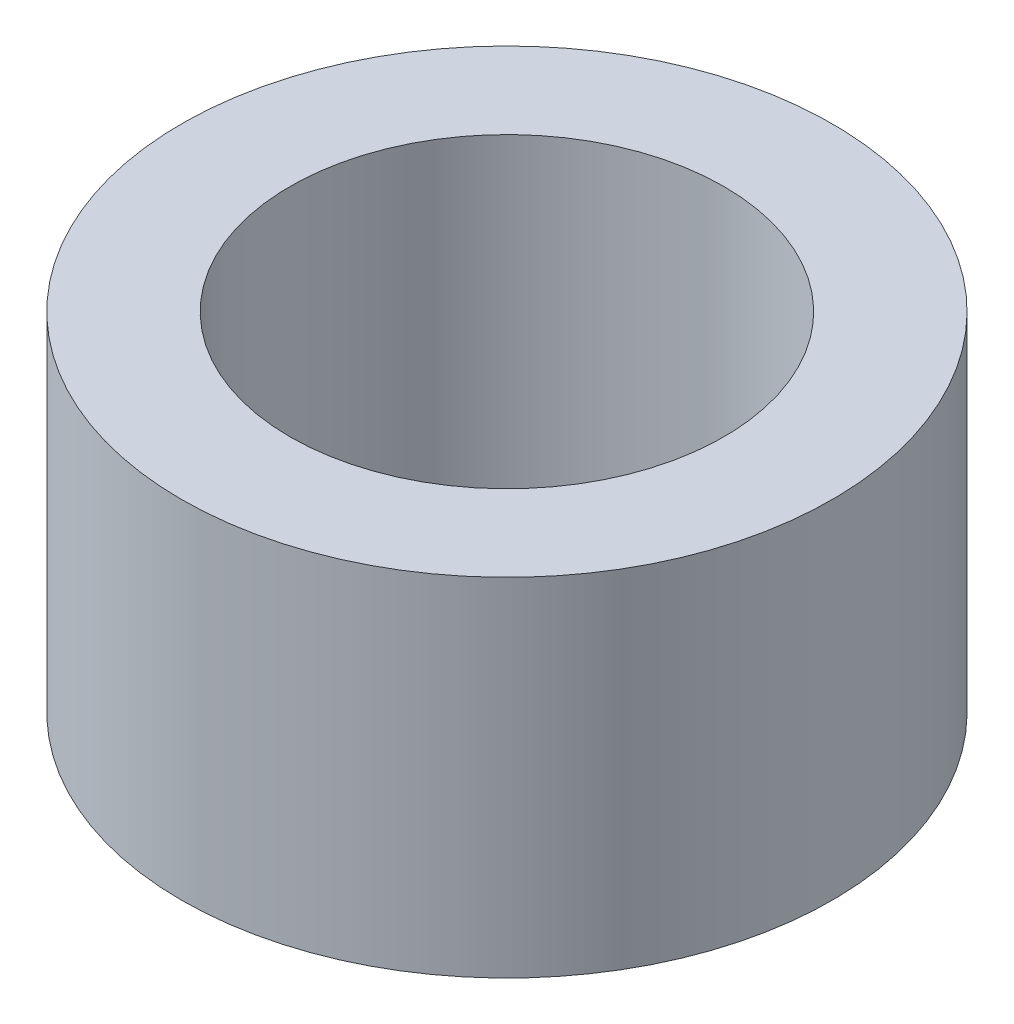
ISO-10303-21;
HEADER;
FILE_DESCRIPTION(('STEP AP214'),'2;1');
FILE_NAME('part.step','',(''),(''),'','','');
FILE_SCHEMA(('AUTOMOTIVE_DESIGN { 1 0 10303 214 1 1 1 1 }'));
ENDSEC;
DATA;
#1=APPLICATION_CONTEXT('core data for automotive mechanical design processes');
#2=APPLICATION_PROTOCOL_DEFINITION('international standard','automotive_design',2000,#1);
#3=PRODUCT_CONTEXT('',#1,'mechanical');
#4=PRODUCT('Part','Part','',(#3));
#5=PRODUCT_RELATED_PRODUCT_CATEGORY('part','',(#4));
#6=PRODUCT_DEFINITION_FORMATION('','',#4);
#7=PRODUCT_DEFINITION_CONTEXT('part definition',#1,'design');
#8=PRODUCT_DEFINITION('design','',#6,#7);
#9=PRODUCT_DEFINITION_SHAPE('','',#8);
#10=(LENGTH_UNIT() NAMED_UNIT(*) SI_UNIT(.MILLI.,.METRE.));
#11=(NAMED_UNIT(*) PLANE_ANGLE_UNIT() SI_UNIT($,.RADIAN.));
#12=(NAMED_UNIT(*) SI_UNIT($,.STERADIAN.) SOLID_ANGLE_UNIT());
#13=UNCERTAINTY_MEASURE_WITH_UNIT(LENGTH_MEASURE(1.E-05),#10,'distance_accuracy_value','');
#14=(GEOMETRIC_REPRESENTATION_CONTEXT(3) GLOBAL_UNCERTAINTY_ASSIGNED_CONTEXT((#13)) GLOBAL_UNIT_ASSIGNED_CONTEXT((#10,
#11,#12)) REPRESENTATION_CONTEXT('',''));
#15=CARTESIAN_POINT('',(0.,0.,0.));
#16=DIRECTION('',(0.,0.,1.));
#17=DIRECTION('',(1.,0.,0.));
#18=AXIS2_PLACEMENT_3D('',#15,#16,#17);
#19=CARTESIAN_POINT('',(0.,4.8,0.));
#20=DIRECTION('',(0.,1.,0.));
#21=DIRECTION('',(0.,0.,1.));
#22=AXIS2_PLACEMENT_3D('',#19,#20,#21);
#23=PLANE('',#22);
#24=CARTESIAN_POINT('',(0.,4.8,0.));
#25=DIRECTION('',(0.,1.,0.));
#26=DIRECTION('',(0.,0.,1.));
#27=AXIS2_PLACEMENT_3D('',#24,#25,#26);
#28=CIRCLE('',#27,4.5);
#29=CARTESIAN_POINT('',(0.,4.8,4.5));
#30=VERTEX_POINT('',#29);
#31=EDGE_CURVE('E10',#30,#30,#28,.T.);
#32=ORIENTED_EDGE('',*,*,#31,.T.);
#33=EDGE_LOOP('',(#32));
#34=FACE_BOUND('',#33,.T.);
#35=CARTESIAN_POINT('',(0.,4.8,0.));
#36=DIRECTION('',(0.,1.,0.));
#37=DIRECTION('',(0.,0.,1.));
#38=AXIS2_PLACEMENT_3D('',#35,#36,#37);
#39=CIRCLE('',#38,3.);
#40=CARTESIAN_POINT('',(0.,4.8,3.));
#41=VERTEX_POINT('',#40);
#42=EDGE_CURVE('E54',#41,#41,#39,.T.);
#43=ORIENTED_EDGE('',*,*,#42,.F.);
#44=EDGE_LOOP('',(#43));
#45=FACE_BOUND('',#44,.T.);
#46=ADVANCED_FACE('F41',(#34,#45),#23,.T.);
#47=CARTESIAN_POINT('',(0.,0.,0.));
#48=DIRECTION('',(0.,1.,0.));
#49=DIRECTION('',(0.,0.,1.));
#50=AXIS2_PLACEMENT_3D('',#47,#48,#49);
#51=PLANE('',#50);
#52=CARTESIAN_POINT('',(0.,0.,0.));
#53=DIRECTION('',(0.,1.,0.));
#54=DIRECTION('',(0.,0.,1.));
#55=AXIS2_PLACEMENT_3D('',#52,#53,#54);
#56=CIRCLE('',#55,4.5);
#57=CARTESIAN_POINT('',(0.,0.,4.5));
#58=VERTEX_POINT('',#57);
#59=EDGE_CURVE('E45',#58,#58,#56,.T.);
#60=ORIENTED_EDGE('',*,*,#59,.F.);
#61=EDGE_LOOP('',(#60));
#62=FACE_BOUND('',#61,.T.);
#63=CARTESIAN_POINT('',(0.,0.,0.));
#64=DIRECTION('',(0.,1.,0.));
#65=DIRECTION('',(0.,0.,1.));
#66=AXIS2_PLACEMENT_3D('',#63,#64,#65);
#67=CIRCLE('',#66,3.);
#68=CARTESIAN_POINT('',(0.,0.,3.));
#69=VERTEX_POINT('',#68);
#70=EDGE_CURVE('E56',#69,#69,#67,.T.);
#71=ORIENTED_EDGE('',*,*,#70,.T.);
#72=EDGE_LOOP('',(#71));
#73=FACE_BOUND('',#72,.T.);
#74=ADVANCED_FACE('F68',(#62,#73),#51,.F.);
#75=CARTESIAN_POINT('',(0.,4.8,0.));
#76=DIRECTION('',(0.,-1.,0.));
#77=DIRECTION('',(0.,0.,-1.));
#78=AXIS2_PLACEMENT_3D('',#75,#76,#77);
#79=CYLINDRICAL_SURFACE('',#78,4.5);
#80=ORIENTED_EDGE('',*,*,#31,.F.);
#81=EDGE_LOOP('',(#80));
#82=FACE_BOUND('',#81,.T.);
#83=ORIENTED_EDGE('',*,*,#59,.T.);
#84=EDGE_LOOP('',(#83));
#85=FACE_BOUND('',#84,.T.);
#86=ADVANCED_FACE('F43',(#82,#85),#79,.T.);
#87=CARTESIAN_POINT('',(0.,4.8,0.));
#88=DIRECTION('',(0.,-1.,0.));
#89=DIRECTION('',(0.,0.,-1.));
#90=AXIS2_PLACEMENT_3D('',#87,#88,#89);
#91=CYLINDRICAL_SURFACE('',#90,3.);
#92=ORIENTED_EDGE('',*,*,#42,.T.);
#93=EDGE_LOOP('',(#92));
#94=FACE_BOUND('',#93,.T.);
#95=ORIENTED_EDGE('',*,*,#70,.F.);
#96=EDGE_LOOP('',(#95));
#97=FACE_BOUND('',#96,.T.);
#98=ADVANCED_FACE('F64',(#94,#97),#91,.F.);
#99=CLOSED_SHELL('',(#46,#74,#86,#98));
#100=MANIFOLD_SOLID_BREP('B2',#99);
#101=ADVANCED_BREP_SHAPE_REPRESENTATION('',(#18,#100),#14);
#102=SHAPE_DEFINITION_REPRESENTATION(#9,#101);
ENDSEC;
END-ISO-10303-21;
